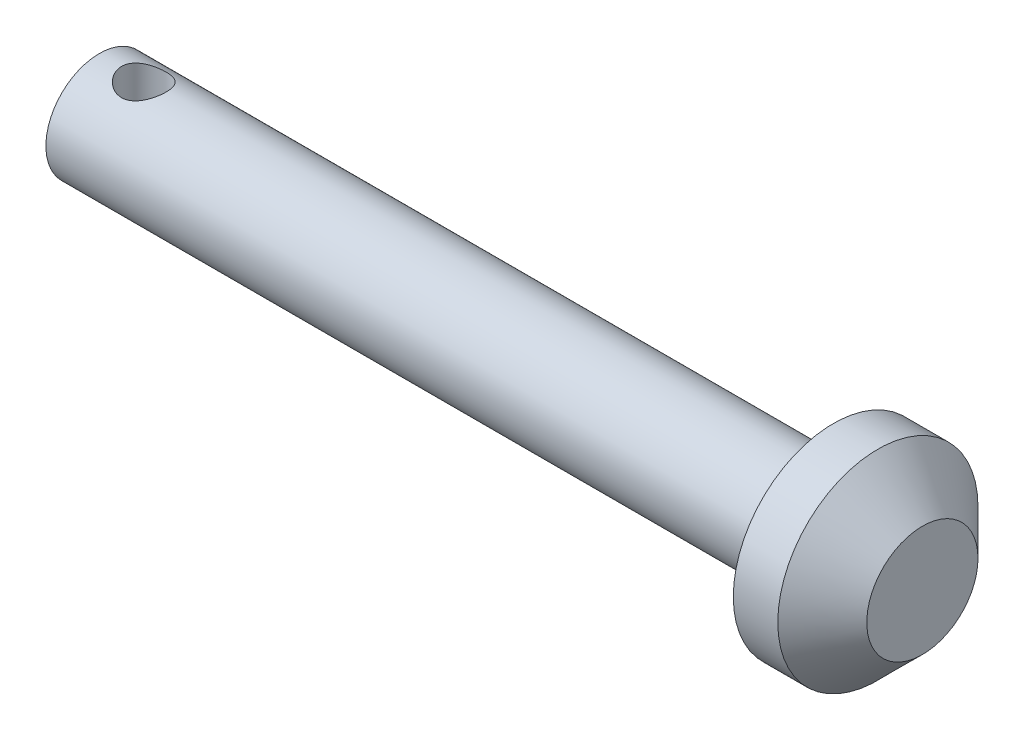
ISO-10303-21;
HEADER;
FILE_DESCRIPTION(('STEP AP214'),'2;1');
FILE_NAME('part.step','',(''),(''),'','','');
FILE_SCHEMA(('AUTOMOTIVE_DESIGN { 1 0 10303 214 1 1 1 1 }'));
ENDSEC;
DATA;
#1=APPLICATION_CONTEXT('core data for automotive mechanical design processes');
#2=APPLICATION_PROTOCOL_DEFINITION('international standard','automotive_design',2000,#1);
#3=PRODUCT_CONTEXT('',#1,'mechanical');
#4=PRODUCT('Part','Part','',(#3));
#5=PRODUCT_RELATED_PRODUCT_CATEGORY('part','',(#4));
#6=PRODUCT_DEFINITION_FORMATION('','',#4);
#7=PRODUCT_DEFINITION_CONTEXT('part definition',#1,'design');
#8=PRODUCT_DEFINITION('design','',#6,#7);
#9=PRODUCT_DEFINITION_SHAPE('','',#8);
#10=(LENGTH_UNIT() NAMED_UNIT(*) SI_UNIT(.MILLI.,.METRE.));
#11=(NAMED_UNIT(*) PLANE_ANGLE_UNIT() SI_UNIT($,.RADIAN.));
#12=(NAMED_UNIT(*) SI_UNIT($,.STERADIAN.) SOLID_ANGLE_UNIT());
#13=UNCERTAINTY_MEASURE_WITH_UNIT(LENGTH_MEASURE(1.E-05),#10,'distance_accuracy_value','');
#14=(GEOMETRIC_REPRESENTATION_CONTEXT(3) GLOBAL_UNCERTAINTY_ASSIGNED_CONTEXT((#13)) GLOBAL_UNIT_ASSIGNED_CONTEXT((#10,
#11,#12)) REPRESENTATION_CONTEXT('',''));
#15=CARTESIAN_POINT('',(0.,0.,0.));
#16=DIRECTION('',(0.,0.,1.));
#17=DIRECTION('',(1.,0.,0.));
#18=AXIS2_PLACEMENT_3D('',#15,#16,#17);
#19=CARTESIAN_POINT('',(-28.,0.,0.));
#20=DIRECTION('',(1.,0.,0.));
#21=DIRECTION('',(0.,0.,-1.));
#22=AXIS2_PLACEMENT_3D('',#19,#20,#21);
#23=CYLINDRICAL_SURFACE('',#22,2.4);
#24=CARTESIAN_POINT('',(-26.,-2.18174242292714,1.));
#25=CARTESIAN_POINT('',(-26.0533375127175,-2.18174815650575,0.999994072532545));
#26=CARTESIAN_POINT('',(-26.106762125461,-2.1837268762752,0.995705631052027));
#27=CARTESIAN_POINT('',(-26.2120695536457,-2.19139066920707,0.978717431582281));
#28=CARTESIAN_POINT('',(-26.2639477813402,-2.19708580659413,0.965994832026216));
#29=CARTESIAN_POINT('',(-26.3644489037529,-2.21141534059814,0.93271990735561));
#30=CARTESIAN_POINT('',(-26.413084130972,-2.22003774050092,0.912199499451428));
#31=CARTESIAN_POINT('',(-26.5062075596624,-2.23923318852634,0.864005102035706));
#32=CARTESIAN_POINT('',(-26.5506967387465,-2.24980577504626,0.836332804732253));
#33=CARTESIAN_POINT('',(-26.6370605799788,-2.27244610095885,0.772779106140936));
#34=CARTESIAN_POINT('',(-26.6786460469953,-2.28456454463316,0.73652259054753));
#35=CARTESIAN_POINT('',(-26.755360177998,-2.30851436297781,0.657617340596444));
#36=CARTESIAN_POINT('',(-26.7904863524904,-2.32034562544631,0.614966153099207));
#37=CARTESIAN_POINT('',(-26.8547596247034,-2.34300430344491,0.522210715037882));
#38=CARTESIAN_POINT('',(-26.8835813024259,-2.35376591980233,0.47186343494693));
#39=CARTESIAN_POINT('',(-26.9322208164045,-2.3724521599474,0.366505617889885));
#40=CARTESIAN_POINT('',(-26.9520426495714,-2.38037804277725,0.311497163897702));
#41=CARTESIAN_POINT('',(-26.9810715670054,-2.39214016833893,0.201414798420135));
#42=CARTESIAN_POINT('',(-26.9907773559216,-2.39616776901973,0.146493260956866));
#43=CARTESIAN_POINT('',(-27.0009101129279,-2.40037462888963,0.0356633442920065));
#44=CARTESIAN_POINT('',(-27.0013408447064,-2.40055544904812,-0.0202446254116114));
#45=CARTESIAN_POINT('',(-26.9931725752533,-2.39716103306445,-0.127834224090053));
#46=CARTESIAN_POINT('',(-26.9851215195794,-2.39381371718931,-0.17956599088585));
#47=CARTESIAN_POINT('',(-26.9611575178895,-2.38405213400247,-0.280866315145164));
#48=CARTESIAN_POINT('',(-26.9452439922959,-2.37763764059661,-0.330434712843932));
#49=CARTESIAN_POINT('',(-26.9058175672843,-2.36223881931223,-0.426910494462019));
#50=CARTESIAN_POINT('',(-26.8821924297033,-2.35321677700868,-0.473765741659924));
#51=CARTESIAN_POINT('',(-26.8281233946397,-2.33348571191844,-0.56296941382557));
#52=CARTESIAN_POINT('',(-26.797677087324,-2.32277609333004,-0.605316238205579));
#53=CARTESIAN_POINT('',(-26.7283340636763,-2.29985359021649,-0.687472729366339));
#54=CARTESIAN_POINT('',(-26.6889929669768,-2.28758795484808,-0.726893149852991));
#55=CARTESIAN_POINT('',(-26.6042308474347,-2.26350288545176,-0.798745131942133));
#56=CARTESIAN_POINT('',(-26.5588074893663,-2.25168362505096,-0.83117399665945));
#57=CARTESIAN_POINT('',(-26.4612839706705,-2.22945289884271,-0.889121514000506));
#58=CARTESIAN_POINT('',(-26.4090134354054,-2.21910046845372,-0.914378026844319));
#59=CARTESIAN_POINT('',(-26.3004151640204,-2.20167875376809,-0.95557145646713));
#60=CARTESIAN_POINT('',(-26.2440903613844,-2.19460712267675,-0.971515037018503));
#61=CARTESIAN_POINT('',(-26.1328825528688,-2.18512970015779,-0.992640201344968));
#62=CARTESIAN_POINT('',(-26.0781431021928,-2.18245095357694,-0.998452917062927));
#63=CARTESIAN_POINT('',(-25.9684172140708,-2.18128229448514,-1.00100504415199));
#64=CARTESIAN_POINT('',(-25.9134308686466,-2.18279093279455,-0.997747594545191));
#65=CARTESIAN_POINT('',(-25.8084812916556,-2.18954505076599,-0.982827820524447));
#66=CARTESIAN_POINT('',(-25.7584218505706,-2.19454510413294,-0.971716950544385));
#67=CARTESIAN_POINT('',(-25.6609189628017,-2.20740504237957,-0.942136468513801));
#68=CARTESIAN_POINT('',(-25.6134761305354,-2.21526559568129,-0.923665136424997));
#69=CARTESIAN_POINT('',(-25.5203077517148,-2.233366382856,-0.879020166441491));
#70=CARTESIAN_POINT('',(-25.4747400203117,-2.24369329761826,-0.852553466449581));
#71=CARTESIAN_POINT('',(-25.3884735580008,-2.26544002992635,-0.792960627508774));
#72=CARTESIAN_POINT('',(-25.3477769466385,-2.27686031936467,-0.759831606300787));
#73=CARTESIAN_POINT('',(-25.2689598920928,-2.30062895827626,-0.684675564572401));
#74=CARTESIAN_POINT('',(-25.2313188800395,-2.31297717367073,-0.642143729183788));
#75=CARTESIAN_POINT('',(-25.1636221664165,-2.33634688947139,-0.551081210042829));
#76=CARTESIAN_POINT('',(-25.133567020749,-2.34736829261611,-0.502550087042922));
#77=CARTESIAN_POINT('',(-25.0819280996451,-2.3669140126852,-0.400523744642704));
#78=CARTESIAN_POINT('',(-25.0603662069684,-2.37543186511061,-0.347016135710802));
#79=CARTESIAN_POINT('',(-25.0267065661325,-2.38894538482693,-0.23668706812353));
#80=CARTESIAN_POINT('',(-25.0146031854191,-2.39394314815936,-0.179867603380153));
#81=CARTESIAN_POINT('',(-25.0009134995838,-2.39961227838008,-0.0688132268051249));
#82=CARTESIAN_POINT('',(-24.9986512002424,-2.4005616362738,-0.0146752678351144));
#83=CARTESIAN_POINT('',(-25.0028905130352,-2.39879618784762,0.0931894493714322));
#84=CARTESIAN_POINT('',(-25.0093905888103,-2.3960820238745,0.146916278032928));
#85=CARTESIAN_POINT('',(-25.0304848577269,-2.38744052785387,0.250469185959351));
#86=CARTESIAN_POINT('',(-25.0447837443756,-2.38163059367387,0.300366030274858));
#87=CARTESIAN_POINT('',(-25.0807473977673,-2.36743599877646,0.397033784401067));
#88=CARTESIAN_POINT('',(-25.1024135637319,-2.35905084899365,0.443804098388665));
#89=CARTESIAN_POINT('',(-25.1535916233716,-2.3400466031893,0.535219652383029));
#90=CARTESIAN_POINT('',(-25.1834138411392,-2.32934367351012,0.57967332638135));
#91=CARTESIAN_POINT('',(-25.2496057462975,-2.30697249499384,0.663134940511029));
#92=CARTESIAN_POINT('',(-25.2859778643254,-2.29530388867038,0.702140849428838));
#93=CARTESIAN_POINT('',(-25.3671558606835,-2.27131876207312,0.776359829785268));
#94=CARTESIAN_POINT('',(-25.4123672116969,-2.25901218286317,0.81113420291878));
#95=CARTESIAN_POINT('',(-25.5083669925442,-2.23596442152148,0.8726666584534));
#96=CARTESIAN_POINT('',(-25.5591585184465,-2.22522411618046,0.899420259654043));
#97=CARTESIAN_POINT('',(-25.6647550680182,-2.20674046186114,0.943862128348622));
#98=CARTESIAN_POINT('',(-25.7195369270346,-2.19898123575892,0.961598589062834));
#99=CARTESIAN_POINT('',(-25.8316316590805,-2.18752642453334,0.987388451630414));
#100=CARTESIAN_POINT('',(-25.8889353658194,-2.18381721283984,0.995474332169685));
#101=CARTESIAN_POINT('',(-25.9642868194095,-2.1819598378615,0.999523719389203));
#102=CARTESIAN_POINT('',(-25.9821385259104,-2.18174050288699,1.00000198496895));
#103=CARTESIAN_POINT('',(-26.,-2.18174242292714,1.));
#104=B_SPLINE_CURVE_WITH_KNOTS('',3,(#24,#25,#26,#27,#28,#29,#30,#31,#32,#33,#34,#35,#36,#37,
#38,#39,#40,#41,#42,#43,#44,#45,#46,#47,#48,#49,#50,#51,#52,#53,#54,#55,#56,#57,#58,#59,#60,#61,
#62,#63,#64,#65,#66,#67,#68,#69,#70,#71,#72,#73,#74,#75,#76,#77,#78,#79,#80,#81,#82,#83,#84,#85,
#86,#87,#88,#89,#90,#91,#92,#93,#94,#95,#96,#97,#98,#99,#100,#101,#102,#103),.UNSPECIFIED.,.T.,
.F.,(4,2,2,2,2,2,2,2,2,2,2,2,2,2,2,2,2,2,2,2,2,2,2,2,2,2,2,2,2,2,2,2,2,2,2,2,2,2,2,4),(0.,
0.159961369588415,0.320357729473743,0.480104521721689,0.639813550840082,0.808534731445234,
0.977320803679289,1.15342781262339,1.32945653419913,1.49632484782362,1.66312544734345,
1.81977472196075,1.97643554561508,2.13548651712053,2.29459376817988,2.46491625475588,
2.63530432353094,2.81129236533378,2.98715432596456,3.15160622645047,3.3160012201476,
3.46987120852954,3.62377717530824,3.78420101454536,3.94469440636373,4.11825330188412,
4.29182491233494,4.46584084764477,4.63975307714407,4.80150908075244,4.96323672641532,
5.11922732029191,5.27524755705739,5.43831890263231,5.60145088839125,5.77568341526463,
5.95001310511352,6.12340100637493,6.29620371636931,6.34977100349366),.UNSPECIFIED.);
#105=CARTESIAN_POINT('',(-26.,-2.18174242292714,1.));
#106=VERTEX_POINT('',#105);
#107=EDGE_CURVE('E44',#106,#106,#104,.T.);
#108=ORIENTED_EDGE('',*,*,#107,.F.);
#109=EDGE_LOOP('',(#108));
#110=FACE_BOUND('',#109,.T.);
#111=CARTESIAN_POINT('',(-26.,2.18174242292714,1.));
#112=CARTESIAN_POINT('',(-25.9466624872825,2.18174815650575,0.999994072532545));
#113=CARTESIAN_POINT('',(-25.893237874539,2.1837268762752,0.995705631052027));
#114=CARTESIAN_POINT('',(-25.7879304463543,2.19139066920707,0.978717431582281));
#115=CARTESIAN_POINT('',(-25.7360522186598,2.19708580659413,0.965994832026215));
#116=CARTESIAN_POINT('',(-25.6355510962471,2.21141534059814,0.932719907355609));
#117=CARTESIAN_POINT('',(-25.586915869028,2.22003774050092,0.912199499451427));
#118=CARTESIAN_POINT('',(-25.4937924403376,2.23923318852634,0.864005102035705));
#119=CARTESIAN_POINT('',(-25.4493032612535,2.24980577504626,0.836332804732253));
#120=CARTESIAN_POINT('',(-25.3629394200212,2.27244610095885,0.772779106140936));
#121=CARTESIAN_POINT('',(-25.3213539530047,2.28456454463316,0.73652259054753));
#122=CARTESIAN_POINT('',(-25.2446398220019,2.30851436297781,0.657617340596444));
#123=CARTESIAN_POINT('',(-25.2095136475096,2.32034562544631,0.614966153099207));
#124=CARTESIAN_POINT('',(-25.1452403752966,2.34300430344491,0.522210715037882));
#125=CARTESIAN_POINT('',(-25.1164186975741,2.35376591980233,0.47186343494693));
#126=CARTESIAN_POINT('',(-25.0677791835955,2.3724521599474,0.366505617889885));
#127=CARTESIAN_POINT('',(-25.0479573504286,2.38037804277725,0.311497163897702));
#128=CARTESIAN_POINT('',(-25.0189284329946,2.39214016833893,0.201414798420135));
#129=CARTESIAN_POINT('',(-25.0092226440784,2.39616776901973,0.146493260956866));
#130=CARTESIAN_POINT('',(-24.9990898870721,2.40037462888963,0.0356633442920064));
#131=CARTESIAN_POINT('',(-24.9986591552936,2.40055544904812,-0.0202446254116115));
#132=CARTESIAN_POINT('',(-25.0068274247467,2.39716103306445,-0.127834224090053));
#133=CARTESIAN_POINT('',(-25.0148784804206,2.39381371718931,-0.17956599088585));
#134=CARTESIAN_POINT('',(-25.0388424821105,2.38405213400247,-0.280866315145164));
#135=CARTESIAN_POINT('',(-25.0547560077041,2.37763764059661,-0.330434712843932));
#136=CARTESIAN_POINT('',(-25.0941824327157,2.36223881931223,-0.42691049446202));
#137=CARTESIAN_POINT('',(-25.1178075702967,2.35321677700868,-0.473765741659924));
#138=CARTESIAN_POINT('',(-25.1718766053603,2.33348571191844,-0.56296941382557));
#139=CARTESIAN_POINT('',(-25.202322912676,2.32277609333004,-0.605316238205579));
#140=CARTESIAN_POINT('',(-25.2716659363237,2.29985359021649,-0.687472729366339));
#141=CARTESIAN_POINT('',(-25.3110070330232,2.28758795484808,-0.726893149852992));
#142=CARTESIAN_POINT('',(-25.3957691525653,2.26350288545176,-0.798745131942134));
#143=CARTESIAN_POINT('',(-25.4411925106337,2.25168362505096,-0.831173996659451));
#144=CARTESIAN_POINT('',(-25.5387160293295,2.22945289884271,-0.889121514000507));
#145=CARTESIAN_POINT('',(-25.5909865645946,2.21910046845371,-0.914378026844322));
#146=CARTESIAN_POINT('',(-25.6995848359796,2.20167875376809,-0.955571456467132));
#147=CARTESIAN_POINT('',(-25.7559096386156,2.19460712267675,-0.971515037018504));
#148=CARTESIAN_POINT('',(-25.8671174471312,2.18512970015779,-0.992640201344968));
#149=CARTESIAN_POINT('',(-25.9218568978072,2.18245095357694,-0.998452917062927));
#150=CARTESIAN_POINT('',(-26.0315827859292,2.18128229448514,-1.00100504415199));
#151=CARTESIAN_POINT('',(-26.0865691313534,2.18279093279455,-0.997747594545191));
#152=CARTESIAN_POINT('',(-26.1915187083444,2.18954505076599,-0.982827820524447));
#153=CARTESIAN_POINT('',(-26.2415781494294,2.19454510413294,-0.971716950544385));
#154=CARTESIAN_POINT('',(-26.3390810371983,2.20740504237957,-0.942136468513801));
#155=CARTESIAN_POINT('',(-26.3865238694646,2.21526559568129,-0.923665136424997));
#156=CARTESIAN_POINT('',(-26.4796922482852,2.233366382856,-0.879020166441491));
#157=CARTESIAN_POINT('',(-26.5252599796883,2.24369329761826,-0.852553466449581));
#158=CARTESIAN_POINT('',(-26.6115264419992,2.26544002992635,-0.792960627508774));
#159=CARTESIAN_POINT('',(-26.6522230533615,2.27686031936467,-0.759831606300787));
#160=CARTESIAN_POINT('',(-26.7310401079072,2.30062895827626,-0.6846755645724));
#161=CARTESIAN_POINT('',(-26.7686811199605,2.31297717367073,-0.642143729183786));
#162=CARTESIAN_POINT('',(-26.8363778335835,2.33634688947139,-0.551081210042826));
#163=CARTESIAN_POINT('',(-26.866432979251,2.34736829261611,-0.502550087042921));
#164=CARTESIAN_POINT('',(-26.9180719003549,2.3669140126852,-0.400523744642704));
#165=CARTESIAN_POINT('',(-26.9396337930316,2.37543186511061,-0.347016135710801));
#166=CARTESIAN_POINT('',(-26.9732934338675,2.38894538482693,-0.236687068123529));
#167=CARTESIAN_POINT('',(-26.9853968145809,2.39394314815936,-0.179867603380152));
#168=CARTESIAN_POINT('',(-26.9990865004162,2.39961227838008,-0.068813226805125));
#169=CARTESIAN_POINT('',(-27.0013487997576,2.4005616362738,-0.0146752678351144));
#170=CARTESIAN_POINT('',(-26.9971094869648,2.39879618784762,0.0931894493714322));
#171=CARTESIAN_POINT('',(-26.9906094111897,2.3960820238745,0.146916278032928));
#172=CARTESIAN_POINT('',(-26.9695151422731,2.38744052785387,0.250469185959352));
#173=CARTESIAN_POINT('',(-26.9552162556244,2.38163059367387,0.300366030274861));
#174=CARTESIAN_POINT('',(-26.9192526022327,2.36743599877646,0.39703378440107));
#175=CARTESIAN_POINT('',(-26.8975864362681,2.35905084899365,0.443804098388666));
#176=CARTESIAN_POINT('',(-26.8464083766284,2.3400466031893,0.53521965238303));
#177=CARTESIAN_POINT('',(-26.8165861588608,2.32934367351012,0.57967332638135));
#178=CARTESIAN_POINT('',(-26.7503942537025,2.30697249499384,0.663134940511029));
#179=CARTESIAN_POINT('',(-26.7140221356746,2.29530388867038,0.702140849428838));
#180=CARTESIAN_POINT('',(-26.6328441393165,2.27131876207312,0.776359829785268));
#181=CARTESIAN_POINT('',(-26.5876327883031,2.25901218286317,0.81113420291878));
#182=CARTESIAN_POINT('',(-26.4916330074558,2.23596442152148,0.8726666584534));
#183=CARTESIAN_POINT('',(-26.4408414815535,2.22522411618046,0.899420259654043));
#184=CARTESIAN_POINT('',(-26.3352449319818,2.20674046186114,0.943862128348622));
#185=CARTESIAN_POINT('',(-26.2804630729654,2.19898123575892,0.961598589062834));
#186=CARTESIAN_POINT('',(-26.1683683409195,2.18752642453334,0.987388451630414));
#187=CARTESIAN_POINT('',(-26.1110646341806,2.18381721283984,0.995474332169685));
#188=CARTESIAN_POINT('',(-26.0357131805905,2.1819598378615,0.999523719389203));
#189=CARTESIAN_POINT('',(-26.0178614740896,2.18174050288699,1.00000198496895));
#190=CARTESIAN_POINT('',(-26.,2.18174242292714,1.));
#191=B_SPLINE_CURVE_WITH_KNOTS('',3,(#111,#112,#113,#114,#115,#116,#117,#118,#119,#120,#121,
#122,#123,#124,#125,#126,#127,#128,#129,#130,#131,#132,#133,#134,#135,#136,#137,#138,#139,#140,
#141,#142,#143,#144,#145,#146,#147,#148,#149,#150,#151,#152,#153,#154,#155,#156,#157,#158,#159,
#160,#161,#162,#163,#164,#165,#166,#167,#168,#169,#170,#171,#172,#173,#174,#175,#176,#177,#178,
#179,#180,#181,#182,#183,#184,#185,#186,#187,#188,#189,#190),.UNSPECIFIED.,.T.,.F.,(4,2,2,2,2,2,
2,2,2,2,2,2,2,2,2,2,2,2,2,2,2,2,2,2,2,2,2,2,2,2,2,2,2,2,2,2,2,2,2,4),(0.,0.159961369588415,
0.320357729473743,0.480104521721693,0.639813550840082,0.808534731445234,0.977320803679289,
1.15342781262339,1.32945653419913,1.49632484782362,1.66312544734345,1.81977472196075,
1.97643554561507,2.13548651712053,2.29459376817988,2.46491625475588,2.63530432353094,
2.81129236533379,2.98715432596456,3.15160622645047,3.3160012201476,3.46987120852954,
3.62377717530824,3.78420101454536,3.94469440636373,4.11825330188412,4.29182491233494,
4.46584084764477,4.63975307714407,4.80150908075244,4.96323672641532,5.11922732029191,
5.27524755705739,5.4383189026323,5.60145088839124,5.77568341526463,5.95001310511352,
6.12340100637494,6.29620371636931,6.34977100349366),.UNSPECIFIED.);
#192=CARTESIAN_POINT('',(-26.,2.18174242292714,1.));
#193=VERTEX_POINT('',#192);
#194=EDGE_CURVE('E62',#193,#193,#191,.T.);
#195=ORIENTED_EDGE('',*,*,#194,.F.);
#196=EDGE_LOOP('',(#195));
#197=FACE_BOUND('',#196,.T.);
#198=CARTESIAN_POINT('',(-28.,0.,0.));
#199=DIRECTION('',(1.,0.,0.));
#200=DIRECTION('',(0.,0.,-1.));
#201=AXIS2_PLACEMENT_3D('',#198,#199,#200);
#202=CIRCLE('',#201,2.4);
#203=CARTESIAN_POINT('',(-28.,0.,-2.4));
#204=VERTEX_POINT('',#203);
#205=EDGE_CURVE('E59',#204,#204,#202,.T.);
#206=ORIENTED_EDGE('',*,*,#205,.T.);
#207=EDGE_LOOP('',(#206));
#208=FACE_BOUND('',#207,.T.);
#209=CARTESIAN_POINT('',(5.,0.,0.));
#210=DIRECTION('',(1.,0.,0.));
#211=DIRECTION('',(0.,0.,-1.));
#212=AXIS2_PLACEMENT_3D('',#209,#210,#211);
#213=CIRCLE('',#212,2.4);
#214=CARTESIAN_POINT('',(5.,0.,-2.4));
#215=VERTEX_POINT('',#214);
#216=EDGE_CURVE('E97',#215,#215,#213,.T.);
#217=ORIENTED_EDGE('',*,*,#216,.F.);
#218=EDGE_LOOP('',(#217));
#219=FACE_BOUND('',#218,.T.);
#220=ADVANCED_FACE('F39',(#110,#197,#208,#219),#23,.T.);
#221=CARTESIAN_POINT('',(-28.,0.,0.));
#222=DIRECTION('',(1.,0.,0.));
#223=DIRECTION('',(0.,0.,-1.));
#224=AXIS2_PLACEMENT_3D('',#221,#222,#223);
#225=PLANE('',#224);
#226=ORIENTED_EDGE('',*,*,#205,.F.);
#227=EDGE_LOOP('',(#226));
#228=FACE_BOUND('',#227,.T.);
#229=ADVANCED_FACE('F86',(#228),#225,.F.);
#230=CARTESIAN_POINT('',(9.,0.,0.));
#231=DIRECTION('',(-1.,0.,0.));
#232=DIRECTION('',(0.,0.,1.));
#233=AXIS2_PLACEMENT_3D('',#230,#231,#232);
#234=CYLINDRICAL_SURFACE('',#233,4.5);
#235=CARTESIAN_POINT('',(6.99999999999999,0.,0.));
#236=DIRECTION('',(1.,0.,0.));
#237=DIRECTION('',(0.,0.,-1.));
#238=AXIS2_PLACEMENT_3D('',#235,#236,#237);
#239=CIRCLE('',#238,4.5);
#240=CARTESIAN_POINT('',(6.99999999999999,0.,-4.5));
#241=VERTEX_POINT('',#240);
#242=EDGE_CURVE('E10',#241,#241,#239,.F.);
#243=ORIENTED_EDGE('',*,*,#242,.T.);
#244=EDGE_LOOP('',(#243));
#245=FACE_BOUND('',#244,.T.);
#246=CARTESIAN_POINT('',(5.,0.,0.));
#247=DIRECTION('',(1.,0.,0.));
#248=DIRECTION('',(0.,0.,-1.));
#249=AXIS2_PLACEMENT_3D('',#246,#247,#248);
#250=CIRCLE('',#249,4.5);
#251=CARTESIAN_POINT('',(5.,0.,-4.5));
#252=VERTEX_POINT('',#251);
#253=EDGE_CURVE('E100',#252,#252,#250,.T.);
#254=ORIENTED_EDGE('',*,*,#253,.T.);
#255=EDGE_LOOP('',(#254));
#256=FACE_BOUND('',#255,.T.);
#257=ADVANCED_FACE('F80',(#245,#256),#234,.T.);
#258=CARTESIAN_POINT('',(9.,0.,0.));
#259=DIRECTION('',(1.,0.,0.));
#260=DIRECTION('',(0.,0.,-1.));
#261=AXIS2_PLACEMENT_3D('',#258,#259,#260);
#262=PLANE('',#261);
#263=CARTESIAN_POINT('',(9.,0.,0.));
#264=DIRECTION('',(1.,0.,0.));
#265=DIRECTION('',(0.,0.,-1.));
#266=AXIS2_PLACEMENT_3D('',#263,#264,#265);
#267=CIRCLE('',#266,2.5);
#268=CARTESIAN_POINT('',(9.,0.,-2.5));
#269=VERTEX_POINT('',#268);
#270=EDGE_CURVE('E53',#269,#269,#267,.T.);
#271=ORIENTED_EDGE('',*,*,#270,.T.);
#272=EDGE_LOOP('',(#271));
#273=FACE_BOUND('',#272,.T.);
#274=ADVANCED_FACE('F75',(#273),#262,.T.);
#275=CARTESIAN_POINT('',(5.,0.,0.));
#276=DIRECTION('',(1.,0.,0.));
#277=DIRECTION('',(0.,0.,-1.));
#278=AXIS2_PLACEMENT_3D('',#275,#276,#277);
#279=PLANE('',#278);
#280=ORIENTED_EDGE('',*,*,#216,.T.);
#281=EDGE_LOOP('',(#280));
#282=FACE_BOUND('',#281,.T.);
#283=ORIENTED_EDGE('',*,*,#253,.F.);
#284=EDGE_LOOP('',(#283));
#285=FACE_BOUND('',#284,.T.);
#286=ADVANCED_FACE('F79',(#282,#285),#279,.F.);
#287=CARTESIAN_POINT('',(9.,0.,0.));
#288=DIRECTION('',(-1.,0.,0.));
#289=DIRECTION('',(0.,0.,1.));
#290=AXIS2_PLACEMENT_3D('',#287,#288,#289);
#291=CONICAL_SURFACE('',#290,2.5,0.785398163397446);
#292=ORIENTED_EDGE('',*,*,#242,.F.);
#293=EDGE_LOOP('',(#292));
#294=FACE_BOUND('',#293,.T.);
#295=ORIENTED_EDGE('',*,*,#270,.F.);
#296=EDGE_LOOP('',(#295));
#297=FACE_BOUND('',#296,.T.);
#298=ADVANCED_FACE('F42',(#294,#297),#291,.T.);
#299=CARTESIAN_POINT('',(-26.,-4.5,0.));
#300=DIRECTION('',(0.,1.,0.));
#301=DIRECTION('',(0.,0.,1.));
#302=AXIS2_PLACEMENT_3D('',#299,#300,#301);
#303=CYLINDRICAL_SURFACE('',#302,1.);
#304=ORIENTED_EDGE('',*,*,#107,.T.);
#305=EDGE_LOOP('',(#304));
#306=FACE_BOUND('',#305,.T.);
#307=ORIENTED_EDGE('',*,*,#194,.T.);
#308=EDGE_LOOP('',(#307));
#309=FACE_BOUND('',#308,.T.);
#310=ADVANCED_FACE('F70',(#306,#309),#303,.F.);
#311=CLOSED_SHELL('',(#220,#229,#257,#274,#286,#298,#310));
#312=MANIFOLD_SOLID_BREP('B2',#311);
#313=ADVANCED_BREP_SHAPE_REPRESENTATION('',(#18,#312),#14);
#314=SHAPE_DEFINITION_REPRESENTATION(#9,#313);
ENDSEC;
END-ISO-10303-21;
